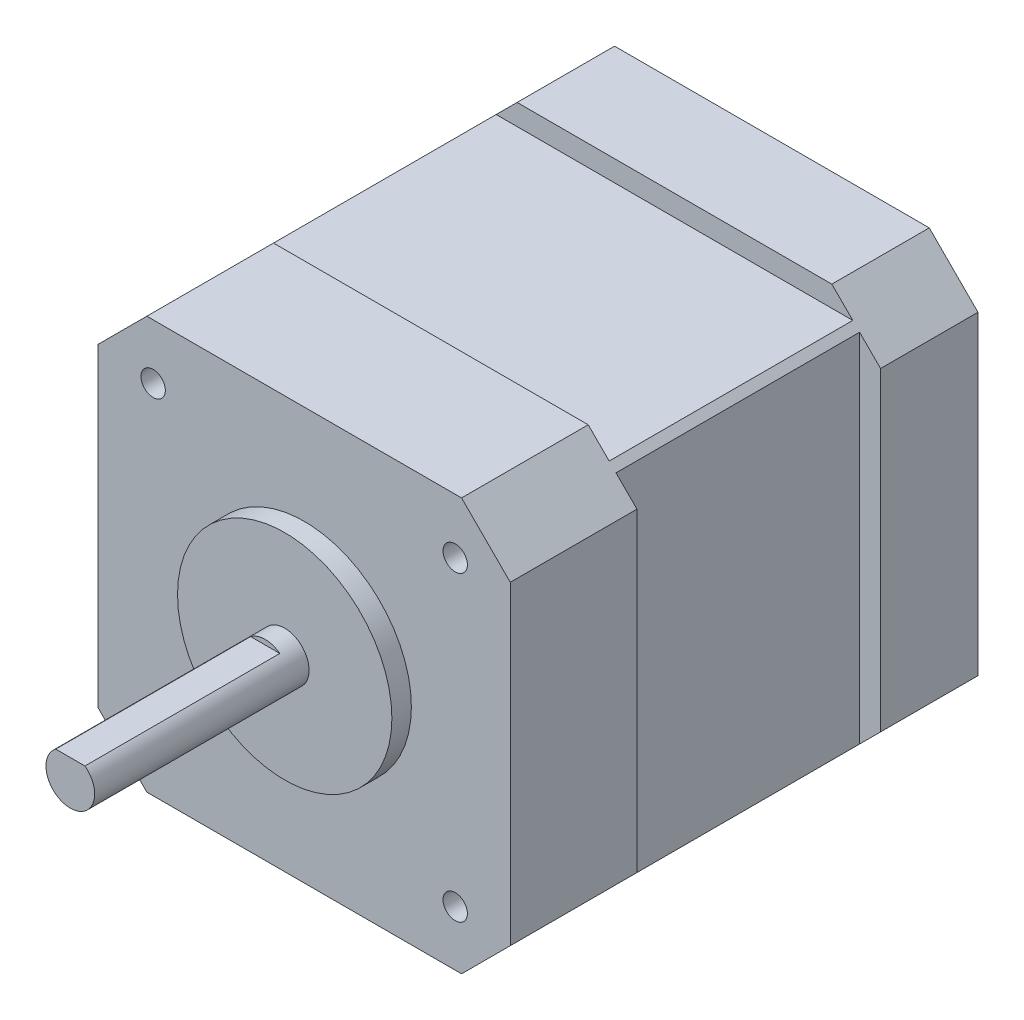
ISO-10303-21;
HEADER;
FILE_DESCRIPTION(('STEP AP214'),'2;1');
FILE_NAME('part.step','',(''),(''),'','','');
FILE_SCHEMA(('AUTOMOTIVE_DESIGN { 1 0 10303 214 1 1 1 1 }'));
ENDSEC;
DATA;
#1=APPLICATION_CONTEXT('core data for automotive mechanical design processes');
#2=APPLICATION_PROTOCOL_DEFINITION('international standard','automotive_design',2000,#1);
#3=PRODUCT_CONTEXT('',#1,'mechanical');
#4=PRODUCT('Part','Part','',(#3));
#5=PRODUCT_RELATED_PRODUCT_CATEGORY('part','',(#4));
#6=PRODUCT_DEFINITION_FORMATION('','',#4);
#7=PRODUCT_DEFINITION_CONTEXT('part definition',#1,'design');
#8=PRODUCT_DEFINITION('design','',#6,#7);
#9=PRODUCT_DEFINITION_SHAPE('','',#8);
#10=(LENGTH_UNIT() NAMED_UNIT(*) SI_UNIT(.MILLI.,.METRE.));
#11=(NAMED_UNIT(*) PLANE_ANGLE_UNIT() SI_UNIT($,.RADIAN.));
#12=(NAMED_UNIT(*) SI_UNIT($,.STERADIAN.) SOLID_ANGLE_UNIT());
#13=UNCERTAINTY_MEASURE_WITH_UNIT(LENGTH_MEASURE(1.E-05),#10,'distance_accuracy_value','');
#14=(GEOMETRIC_REPRESENTATION_CONTEXT(3) GLOBAL_UNCERTAINTY_ASSIGNED_CONTEXT((#13)) GLOBAL_UNIT_ASSIGNED_CONTEXT((#10,
#11,#12)) REPRESENTATION_CONTEXT('',''));
#15=CARTESIAN_POINT('',(0.,0.,0.));
#16=DIRECTION('',(0.,0.,1.));
#17=DIRECTION('',(1.,0.,0.));
#18=AXIS2_PLACEMENT_3D('',#15,#16,#17);
#19=CARTESIAN_POINT('',(0.,0.,48.));
#20=DIRECTION('',(1.,0.,0.));
#21=DIRECTION('',(0.,1.,0.));
#22=AXIS2_PLACEMENT_3D('',#19,#20,#21);
#23=PLANE('',#22);
#24=DIRECTION('',(0.,1.,0.));
#25=VECTOR('',#24,1.);
#26=CARTESIAN_POINT('',(0.,0.,35.));
#27=LINE('',#26,#25);
#28=CARTESIAN_POINT('',(0.,-37.3,35.));
#29=VERTEX_POINT('',#28);
#30=CARTESIAN_POINT('',(0.,-5.,35.));
#31=VERTEX_POINT('',#30);
#32=EDGE_CURVE('E407',#29,#31,#27,.T.);
#33=ORIENTED_EDGE('',*,*,#32,.F.);
#34=DIRECTION('',(0.,0.,1.));
#35=VECTOR('',#34,1.);
#36=CARTESIAN_POINT('',(0.,-37.3,48.));
#37=LINE('',#36,#35);
#38=CARTESIAN_POINT('',(0.,-37.3,48.));
#39=VERTEX_POINT('',#38);
#40=EDGE_CURVE('E309',#29,#39,#37,.T.);
#41=ORIENTED_EDGE('',*,*,#40,.T.);
#42=DIRECTION('',(0.,-1.,0.));
#43=VECTOR('',#42,1.);
#44=CARTESIAN_POINT('',(0.,0.,48.));
#45=LINE('',#44,#43);
#46=CARTESIAN_POINT('',(0.,-4.99999999999999,48.));
#47=VERTEX_POINT('',#46);
#48=EDGE_CURVE('E250',#47,#39,#45,.T.);
#49=ORIENTED_EDGE('',*,*,#48,.F.);
#50=DIRECTION('',(0.,0.,-1.));
#51=VECTOR('',#50,1.);
#52=CARTESIAN_POINT('',(0.,-5.,48.));
#53=LINE('',#52,#51);
#54=EDGE_CURVE('E306',#47,#31,#53,.T.);
#55=ORIENTED_EDGE('',*,*,#54,.T.);
#56=EDGE_LOOP('',(#33,#41,#49,#55));
#57=FACE_BOUND('',#56,.T.);
#58=ADVANCED_FACE('F37',(#57),#23,.F.);
#59=CARTESIAN_POINT('',(0.,-42.3,48.));
#60=DIRECTION('',(0.,1.,0.));
#61=DIRECTION('',(0.,0.,1.));
#62=AXIS2_PLACEMENT_3D('',#59,#60,#61);
#63=PLANE('',#62);
#64=DIRECTION('',(-1.,0.,0.));
#65=VECTOR('',#64,1.);
#66=CARTESIAN_POINT('',(0.,-42.3,35.));
#67=LINE('',#66,#65);
#68=CARTESIAN_POINT('',(37.3,-42.3,35.));
#69=VERTEX_POINT('',#68);
#70=CARTESIAN_POINT('',(4.99999999999998,-42.3,35.));
#71=VERTEX_POINT('',#70);
#72=EDGE_CURVE('E412',#69,#71,#67,.T.);
#73=ORIENTED_EDGE('',*,*,#72,.F.);
#74=DIRECTION('',(0.,0.,1.));
#75=VECTOR('',#74,1.);
#76=CARTESIAN_POINT('',(37.3,-42.3,48.));
#77=LINE('',#76,#75);
#78=CARTESIAN_POINT('',(37.3,-42.3,48.));
#79=VERTEX_POINT('',#78);
#80=EDGE_CURVE('E293',#69,#79,#77,.T.);
#81=ORIENTED_EDGE('',*,*,#80,.T.);
#82=DIRECTION('',(1.,0.,0.));
#83=VECTOR('',#82,1.);
#84=CARTESIAN_POINT('',(0.,-42.3,48.));
#85=LINE('',#84,#83);
#86=CARTESIAN_POINT('',(4.99999999999998,-42.3,48.));
#87=VERTEX_POINT('',#86);
#88=EDGE_CURVE('E253',#87,#79,#85,.T.);
#89=ORIENTED_EDGE('',*,*,#88,.F.);
#90=DIRECTION('',(0.,0.,-1.));
#91=VECTOR('',#90,1.);
#92=CARTESIAN_POINT('',(4.99999999999998,-42.3,48.));
#93=LINE('',#92,#91);
#94=EDGE_CURVE('E290',#87,#71,#93,.T.);
#95=ORIENTED_EDGE('',*,*,#94,.T.);
#96=EDGE_LOOP('',(#73,#81,#89,#95));
#97=FACE_BOUND('',#96,.T.);
#98=ADVANCED_FACE('F459',(#97),#63,.F.);
#99=CARTESIAN_POINT('',(42.3,0.,48.));
#100=DIRECTION('',(-1.,0.,0.));
#101=DIRECTION('',(0.,-1.,0.));
#102=AXIS2_PLACEMENT_3D('',#99,#100,#101);
#103=PLANE('',#102);
#104=DIRECTION('',(0.,-1.,0.));
#105=VECTOR('',#104,1.);
#106=CARTESIAN_POINT('',(42.3,0.,35.));
#107=LINE('',#106,#105);
#108=CARTESIAN_POINT('',(42.3,-5.00000000000002,35.));
#109=VERTEX_POINT('',#108);
#110=CARTESIAN_POINT('',(42.3,-37.3,35.));
#111=VERTEX_POINT('',#110);
#112=EDGE_CURVE('E400',#109,#111,#107,.T.);
#113=ORIENTED_EDGE('',*,*,#112,.F.);
#114=DIRECTION('',(0.,0.,1.));
#115=VECTOR('',#114,1.);
#116=CARTESIAN_POINT('',(42.3,-5.00000000000002,48.));
#117=LINE('',#116,#115);
#118=CARTESIAN_POINT('',(42.3,-5.,48.));
#119=VERTEX_POINT('',#118);
#120=EDGE_CURVE('E263',#109,#119,#117,.T.);
#121=ORIENTED_EDGE('',*,*,#120,.T.);
#122=DIRECTION('',(0.,1.,0.));
#123=VECTOR('',#122,1.);
#124=CARTESIAN_POINT('',(42.3,0.,48.));
#125=LINE('',#124,#123);
#126=CARTESIAN_POINT('',(42.3,-37.3,48.));
#127=VERTEX_POINT('',#126);
#128=EDGE_CURVE('E257',#127,#119,#125,.T.);
#129=ORIENTED_EDGE('',*,*,#128,.F.);
#130=DIRECTION('',(0.,0.,-1.));
#131=VECTOR('',#130,1.);
#132=CARTESIAN_POINT('',(42.3,-37.3,48.));
#133=LINE('',#132,#131);
#134=EDGE_CURVE('E278',#127,#111,#133,.T.);
#135=ORIENTED_EDGE('',*,*,#134,.T.);
#136=EDGE_LOOP('',(#113,#121,#129,#135));
#137=FACE_BOUND('',#136,.T.);
#138=ADVANCED_FACE('F466',(#137),#103,.F.);
#139=CARTESIAN_POINT('',(0.,0.,48.));
#140=DIRECTION('',(0.,-1.,0.));
#141=DIRECTION('',(0.,0.,-1.));
#142=AXIS2_PLACEMENT_3D('',#139,#140,#141);
#143=PLANE('',#142);
#144=DIRECTION('',(1.,0.,0.));
#145=VECTOR('',#144,1.);
#146=CARTESIAN_POINT('',(0.,0.,35.));
#147=LINE('',#146,#145);
#148=CARTESIAN_POINT('',(5.00000000000002,0.,35.));
#149=VERTEX_POINT('',#148);
#150=CARTESIAN_POINT('',(37.3,0.,35.));
#151=VERTEX_POINT('',#150);
#152=EDGE_CURVE('E395',#149,#151,#147,.T.);
#153=ORIENTED_EDGE('',*,*,#152,.F.);
#154=DIRECTION('',(0.,0.,1.));
#155=VECTOR('',#154,1.);
#156=CARTESIAN_POINT('',(5.00000000000002,0.,48.));
#157=LINE('',#156,#155);
#158=CARTESIAN_POINT('',(5.00000000000002,0.,48.));
#159=VERTEX_POINT('',#158);
#160=EDGE_CURVE('E317',#149,#159,#157,.T.);
#161=ORIENTED_EDGE('',*,*,#160,.T.);
#162=DIRECTION('',(-1.,0.,0.));
#163=VECTOR('',#162,1.);
#164=CARTESIAN_POINT('',(0.,0.,48.));
#165=LINE('',#164,#163);
#166=CARTESIAN_POINT('',(37.3,0.,48.));
#167=VERTEX_POINT('',#166);
#168=EDGE_CURVE('E260',#167,#159,#165,.T.);
#169=ORIENTED_EDGE('',*,*,#168,.F.);
#170=DIRECTION('',(0.,0.,-1.));
#171=VECTOR('',#170,1.);
#172=CARTESIAN_POINT('',(37.3,0.,48.));
#173=LINE('',#172,#171);
#174=EDGE_CURVE('E314',#167,#151,#173,.T.);
#175=ORIENTED_EDGE('',*,*,#174,.T.);
#176=EDGE_LOOP('',(#153,#161,#169,#175));
#177=FACE_BOUND('',#176,.T.);
#178=ADVANCED_FACE('F729',(#177),#143,.F.);
#179=CARTESIAN_POINT('',(42.3,-37.3,48.));
#180=DIRECTION('',(-0.707106781186545,0.707106781186549,0.));
#181=DIRECTION('',(-0.707106781186549,-0.707106781186546,0.));
#182=AXIS2_PLACEMENT_3D('',#179,#180,#181);
#183=PLANE('',#182);
#184=DIRECTION('',(0.,0.,-1.));
#185=VECTOR('',#184,1.);
#186=CARTESIAN_POINT('',(40.15,-39.45,48.));
#187=LINE('',#186,#185);
#188=CARTESIAN_POINT('',(40.15,-39.45,10.));
#189=VERTEX_POINT('',#188);
#190=CARTESIAN_POINT('',(40.15,-39.45,35.));
#191=VERTEX_POINT('',#190);
#192=EDGE_CURVE('E373',#189,#191,#187,.F.);
#193=ORIENTED_EDGE('',*,*,#192,.T.);
#194=DIRECTION('',(-0.707106781186549,-0.707106781186546,0.));
#195=VECTOR('',#194,1.);
#196=CARTESIAN_POINT('',(42.3,-37.3,35.));
#197=LINE('',#196,#195);
#198=EDGE_CURVE('E403',#191,#111,#197,.F.);
#199=ORIENTED_EDGE('',*,*,#198,.T.);
#200=ORIENTED_EDGE('',*,*,#134,.F.);
#201=DIRECTION('',(-0.707106781186549,-0.707106781186546,0.));
#202=VECTOR('',#201,1.);
#203=CARTESIAN_POINT('',(18.6499999999999,-60.95,48.));
#204=LINE('',#203,#202);
#205=EDGE_CURVE('E303',#79,#127,#204,.F.);
#206=ORIENTED_EDGE('',*,*,#205,.F.);
#207=ORIENTED_EDGE('',*,*,#80,.F.);
#208=CARTESIAN_POINT('',(39.45,-40.15,35.));
#209=VERTEX_POINT('',#208);
#210=EDGE_CURVE('E406',#69,#209,#197,.F.);
#211=ORIENTED_EDGE('',*,*,#210,.T.);
#212=DIRECTION('',(0.,0.,1.));
#213=VECTOR('',#212,1.);
#214=CARTESIAN_POINT('',(39.45,-40.15,48.));
#215=LINE('',#214,#213);
#216=CARTESIAN_POINT('',(39.45,-40.15,10.));
#217=VERTEX_POINT('',#216);
#218=EDGE_CURVE('E417',#209,#217,#215,.F.);
#219=ORIENTED_EDGE('',*,*,#218,.T.);
#220=DIRECTION('',(-0.707106781186549,-0.707106781186546,0.));
#221=VECTOR('',#220,1.);
#222=CARTESIAN_POINT('',(42.3,-37.3,10.));
#223=LINE('',#222,#221);
#224=CARTESIAN_POINT('',(37.3,-42.3,10.));
#225=VERTEX_POINT('',#224);
#226=EDGE_CURVE('E356',#225,#217,#223,.F.);
#227=ORIENTED_EDGE('',*,*,#226,.F.);
#228=CARTESIAN_POINT('',(37.3,-42.3,0.));
#229=VERTEX_POINT('',#228);
#230=EDGE_CURVE('E294',#229,#225,#77,.T.);
#231=ORIENTED_EDGE('',*,*,#230,.F.);
#232=DIRECTION('',(0.707106781186549,0.707106781186546,0.));
#233=VECTOR('',#232,1.);
#234=CARTESIAN_POINT('',(42.3,-37.3,0.));
#235=LINE('',#234,#233);
#236=CARTESIAN_POINT('',(42.3,-37.3,0.));
#237=VERTEX_POINT('',#236);
#238=EDGE_CURVE('E287',#237,#229,#235,.F.);
#239=ORIENTED_EDGE('',*,*,#238,.F.);
#240=CARTESIAN_POINT('',(42.3,-37.3,10.));
#241=VERTEX_POINT('',#240);
#242=EDGE_CURVE('E277',#241,#237,#133,.T.);
#243=ORIENTED_EDGE('',*,*,#242,.F.);
#244=EDGE_CURVE('E386',#189,#241,#223,.F.);
#245=ORIENTED_EDGE('',*,*,#244,.F.);
#246=EDGE_LOOP('',(#193,#199,#200,#206,#207,#211,#219,#227,#231,#239,#243,#245));
#247=FACE_BOUND('',#246,.T.);
#248=ADVANCED_FACE('F514',(#247),#183,.F.);
#249=CARTESIAN_POINT('',(4.99999999999998,-42.3,48.));
#250=DIRECTION('',(0.707106781186549,0.707106781186546,0.));
#251=DIRECTION('',(-0.707106781186546,0.707106781186549,0.));
#252=AXIS2_PLACEMENT_3D('',#249,#250,#251);
#253=PLANE('',#252);
#254=ORIENTED_EDGE('',*,*,#40,.F.);
#255=DIRECTION('',(-0.707106781186546,0.707106781186549,0.));
#256=VECTOR('',#255,1.);
#257=CARTESIAN_POINT('',(4.99999999999998,-42.3,35.));
#258=LINE('',#257,#256);
#259=CARTESIAN_POINT('',(2.15,-39.45,35.));
#260=VERTEX_POINT('',#259);
#261=EDGE_CURVE('E409',#29,#260,#258,.F.);
#262=ORIENTED_EDGE('',*,*,#261,.T.);
#263=DIRECTION('',(0.,0.,1.));
#264=VECTOR('',#263,1.);
#265=CARTESIAN_POINT('',(2.15,-39.45,48.));
#266=LINE('',#265,#264);
#267=CARTESIAN_POINT('',(2.15,-39.45,10.));
#268=VERTEX_POINT('',#267);
#269=EDGE_CURVE('E414',#260,#268,#266,.F.);
#270=ORIENTED_EDGE('',*,*,#269,.T.);
#271=DIRECTION('',(-0.707106781186546,0.707106781186549,0.));
#272=VECTOR('',#271,1.);
#273=CARTESIAN_POINT('',(4.99999999999998,-42.3,10.));
#274=LINE('',#273,#272);
#275=CARTESIAN_POINT('',(0.,-37.3,10.));
#276=VERTEX_POINT('',#275);
#277=EDGE_CURVE('E391',#276,#268,#274,.F.);
#278=ORIENTED_EDGE('',*,*,#277,.F.);
#279=CARTESIAN_POINT('',(0.,-37.3,0.));
#280=VERTEX_POINT('',#279);
#281=EDGE_CURVE('E310',#280,#276,#37,.T.);
#282=ORIENTED_EDGE('',*,*,#281,.F.);
#283=DIRECTION('',(0.707106781186546,-0.707106781186549,0.));
#284=VECTOR('',#283,1.);
#285=CARTESIAN_POINT('',(4.99999999999998,-42.3,0.));
#286=LINE('',#285,#284);
#287=CARTESIAN_POINT('',(4.99999999999998,-42.3,0.));
#288=VERTEX_POINT('',#287);
#289=EDGE_CURVE('E285',#288,#280,#286,.F.);
#290=ORIENTED_EDGE('',*,*,#289,.F.);
#291=CARTESIAN_POINT('',(4.99999999999998,-42.3,10.));
#292=VERTEX_POINT('',#291);
#293=EDGE_CURVE('E289',#292,#288,#93,.T.);
#294=ORIENTED_EDGE('',*,*,#293,.F.);
#295=CARTESIAN_POINT('',(2.85,-40.15,10.));
#296=VERTEX_POINT('',#295);
#297=EDGE_CURVE('E346',#296,#292,#274,.F.);
#298=ORIENTED_EDGE('',*,*,#297,.F.);
#299=DIRECTION('',(0.,0.,-1.));
#300=VECTOR('',#299,1.);
#301=CARTESIAN_POINT('',(2.85,-40.15,48.));
#302=LINE('',#301,#300);
#303=CARTESIAN_POINT('',(2.85,-40.15,35.));
#304=VERTEX_POINT('',#303);
#305=EDGE_CURVE('E226',#296,#304,#302,.F.);
#306=ORIENTED_EDGE('',*,*,#305,.T.);
#307=EDGE_CURVE('E344',#304,#71,#258,.F.);
#308=ORIENTED_EDGE('',*,*,#307,.T.);
#309=ORIENTED_EDGE('',*,*,#94,.F.);
#310=DIRECTION('',(-0.707106781186546,0.707106781186549,0.));
#311=VECTOR('',#310,1.);
#312=CARTESIAN_POINT('',(2.50000000000001,-39.8,48.));
#313=LINE('',#312,#311);
#314=EDGE_CURVE('E301',#39,#87,#313,.F.);
#315=ORIENTED_EDGE('',*,*,#314,.F.);
#316=EDGE_LOOP('',(#254,#262,#270,#278,#282,#290,#294,#298,#306,#308,#309,#315));
#317=FACE_BOUND('',#316,.T.);
#318=ADVANCED_FACE('F342',(#317),#253,.F.);
#319=CARTESIAN_POINT('',(0.,-5.,48.));
#320=DIRECTION('',(0.707106781186547,-0.707106781186549,0.));
#321=DIRECTION('',(0.707106781186549,0.707106781186547,0.));
#322=AXIS2_PLACEMENT_3D('',#319,#320,#321);
#323=PLANE('',#322);
#324=ORIENTED_EDGE('',*,*,#160,.F.);
#325=DIRECTION('',(0.707106781186549,0.707106781186547,0.));
#326=VECTOR('',#325,1.);
#327=CARTESIAN_POINT('',(0.,-5.,35.));
#328=LINE('',#327,#326);
#329=CARTESIAN_POINT('',(2.85000000000001,-2.15000000000001,35.));
#330=VERTEX_POINT('',#329);
#331=EDGE_CURVE('E397',#149,#330,#328,.F.);
#332=ORIENTED_EDGE('',*,*,#331,.T.);
#333=DIRECTION('',(0.,0.,1.));
#334=VECTOR('',#333,1.);
#335=CARTESIAN_POINT('',(2.85000000000001,-2.15000000000001,48.));
#336=LINE('',#335,#334);
#337=CARTESIAN_POINT('',(2.85000000000001,-2.15000000000001,10.));
#338=VERTEX_POINT('',#337);
#339=EDGE_CURVE('E370',#330,#338,#336,.F.);
#340=ORIENTED_EDGE('',*,*,#339,.T.);
#341=DIRECTION('',(0.707106781186549,0.707106781186547,0.));
#342=VECTOR('',#341,1.);
#343=CARTESIAN_POINT('',(0.,-5.,10.));
#344=LINE('',#343,#342);
#345=CARTESIAN_POINT('',(5.00000000000002,0.,10.));
#346=VERTEX_POINT('',#345);
#347=EDGE_CURVE('E380',#346,#338,#344,.F.);
#348=ORIENTED_EDGE('',*,*,#347,.F.);
#349=CARTESIAN_POINT('',(5.00000000000002,0.,0.));
#350=VERTEX_POINT('',#349);
#351=EDGE_CURVE('E318',#350,#346,#157,.T.);
#352=ORIENTED_EDGE('',*,*,#351,.F.);
#353=DIRECTION('',(-0.707106781186549,-0.707106781186547,0.));
#354=VECTOR('',#353,1.);
#355=CARTESIAN_POINT('',(0.,-5.,0.));
#356=LINE('',#355,#354);
#357=CARTESIAN_POINT('',(0.,-5.,0.));
#358=VERTEX_POINT('',#357);
#359=EDGE_CURVE('E283',#358,#350,#356,.F.);
#360=ORIENTED_EDGE('',*,*,#359,.F.);
#361=CARTESIAN_POINT('',(0.,-5.,10.));
#362=VERTEX_POINT('',#361);
#363=EDGE_CURVE('E305',#362,#358,#53,.T.);
#364=ORIENTED_EDGE('',*,*,#363,.F.);
#365=CARTESIAN_POINT('',(2.15000000000001,-2.85,10.));
#366=VERTEX_POINT('',#365);
#367=EDGE_CURVE('E383',#366,#362,#344,.F.);
#368=ORIENTED_EDGE('',*,*,#367,.F.);
#369=DIRECTION('',(0.,0.,-1.));
#370=VECTOR('',#369,1.);
#371=CARTESIAN_POINT('',(2.15000000000001,-2.85,48.));
#372=LINE('',#371,#370);
#373=CARTESIAN_POINT('',(2.15000000000001,-2.85,35.));
#374=VERTEX_POINT('',#373);
#375=EDGE_CURVE('E334',#366,#374,#372,.F.);
#376=ORIENTED_EDGE('',*,*,#375,.T.);
#377=EDGE_CURVE('E401',#374,#31,#328,.F.);
#378=ORIENTED_EDGE('',*,*,#377,.T.);
#379=ORIENTED_EDGE('',*,*,#54,.F.);
#380=DIRECTION('',(0.707106781186549,0.707106781186547,0.));
#381=VECTOR('',#380,1.);
#382=CARTESIAN_POINT('',(-18.65,-23.6499999999999,48.));
#383=LINE('',#382,#381);
#384=EDGE_CURVE('E299',#159,#47,#383,.F.);
#385=ORIENTED_EDGE('',*,*,#384,.F.);
#386=EDGE_LOOP('',(#324,#332,#340,#348,#352,#360,#364,#368,#376,#378,#379,#385));
#387=FACE_BOUND('',#386,.T.);
#388=ADVANCED_FACE('F502',(#387),#323,.F.);
#389=CARTESIAN_POINT('',(37.3,0.,48.));
#390=DIRECTION('',(-0.707106781186549,-0.707106781186547,0.));
#391=DIRECTION('',(0.707106781186547,-0.707106781186549,0.));
#392=AXIS2_PLACEMENT_3D('',#389,#390,#391);
#393=PLANE('',#392);
#394=ORIENTED_EDGE('',*,*,#120,.F.);
#395=DIRECTION('',(0.707106781186547,-0.707106781186549,0.));
#396=VECTOR('',#395,1.);
#397=CARTESIAN_POINT('',(37.3,0.,35.));
#398=LINE('',#397,#396);
#399=CARTESIAN_POINT('',(40.15,-2.85000000000002,35.));
#400=VERTEX_POINT('',#399);
#401=EDGE_CURVE('E331',#109,#400,#398,.F.);
#402=ORIENTED_EDGE('',*,*,#401,.T.);
#403=DIRECTION('',(0.,0.,1.));
#404=VECTOR('',#403,1.);
#405=CARTESIAN_POINT('',(40.15,-2.85000000000002,48.));
#406=LINE('',#405,#404);
#407=CARTESIAN_POINT('',(40.15,-2.85000000000002,10.));
#408=VERTEX_POINT('',#407);
#409=EDGE_CURVE('E330',#400,#408,#406,.F.);
#410=ORIENTED_EDGE('',*,*,#409,.T.);
#411=DIRECTION('',(0.707106781186547,-0.707106781186549,0.));
#412=VECTOR('',#411,1.);
#413=CARTESIAN_POINT('',(37.3,0.,10.));
#414=LINE('',#413,#412);
#415=CARTESIAN_POINT('',(42.3,-5.00000000000002,10.));
#416=VERTEX_POINT('',#415);
#417=EDGE_CURVE('E327',#416,#408,#414,.F.);
#418=ORIENTED_EDGE('',*,*,#417,.F.);
#419=CARTESIAN_POINT('',(42.3,-5.00000000000002,0.));
#420=VERTEX_POINT('',#419);
#421=EDGE_CURVE('E274',#420,#416,#117,.T.);
#422=ORIENTED_EDGE('',*,*,#421,.F.);
#423=DIRECTION('',(-0.707106781186547,0.707106781186549,0.));
#424=VECTOR('',#423,1.);
#425=CARTESIAN_POINT('',(37.3,0.,0.));
#426=LINE('',#425,#424);
#427=CARTESIAN_POINT('',(37.3,0.,0.));
#428=VERTEX_POINT('',#427);
#429=EDGE_CURVE('E281',#428,#420,#426,.F.);
#430=ORIENTED_EDGE('',*,*,#429,.F.);
#431=CARTESIAN_POINT('',(37.3,0.,10.));
#432=VERTEX_POINT('',#431);
#433=EDGE_CURVE('E313',#432,#428,#173,.T.);
#434=ORIENTED_EDGE('',*,*,#433,.F.);
#435=CARTESIAN_POINT('',(39.45,-2.15000000000001,10.));
#436=VERTEX_POINT('',#435);
#437=EDGE_CURVE('E324',#436,#432,#414,.F.);
#438=ORIENTED_EDGE('',*,*,#437,.F.);
#439=DIRECTION('',(0.,0.,-1.));
#440=VECTOR('',#439,1.);
#441=CARTESIAN_POINT('',(39.45,-2.15000000000001,48.));
#442=LINE('',#441,#440);
#443=CARTESIAN_POINT('',(39.45,-2.15000000000001,35.));
#444=VERTEX_POINT('',#443);
#445=EDGE_CURVE('E321',#436,#444,#442,.F.);
#446=ORIENTED_EDGE('',*,*,#445,.T.);
#447=EDGE_CURVE('E326',#444,#151,#398,.F.);
#448=ORIENTED_EDGE('',*,*,#447,.T.);
#449=ORIENTED_EDGE('',*,*,#174,.F.);
#450=DIRECTION('',(0.707106781186547,-0.707106781186549,0.));
#451=VECTOR('',#450,1.);
#452=CARTESIAN_POINT('',(39.8000000000001,-2.50000000000006,48.));
#453=LINE('',#452,#451);
#454=EDGE_CURVE('E297',#119,#167,#453,.F.);
#455=ORIENTED_EDGE('',*,*,#454,.F.);
#456=EDGE_LOOP('',(#394,#402,#410,#418,#422,#430,#434,#438,#446,#448,#449,#455));
#457=FACE_BOUND('',#456,.T.);
#458=ADVANCED_FACE('F39',(#457),#393,.F.);
#459=CARTESIAN_POINT('',(21.15,-21.15,50.));
#460=DIRECTION('',(0.,0.,1.));
#461=DIRECTION('',(1.,0.,0.));
#462=AXIS2_PLACEMENT_3D('',#459,#460,#461);
#463=PLANE('',#462);
#464=CARTESIAN_POINT('',(21.15,-21.15,50.));
#465=DIRECTION('',(0.,0.,1.));
#466=DIRECTION('',(1.,0.,0.));
#467=AXIS2_PLACEMENT_3D('',#464,#465,#466);
#468=CIRCLE('',#467,11.);
#469=CARTESIAN_POINT('',(32.15,-21.15,50.));
#470=VERTEX_POINT('',#469);
#471=EDGE_CURVE('E239',#470,#470,#468,.T.);
#472=ORIENTED_EDGE('',*,*,#471,.T.);
#473=EDGE_LOOP('',(#472));
#474=FACE_BOUND('',#473,.T.);
#475=CARTESIAN_POINT('',(21.15,-21.15,50.));
#476=DIRECTION('',(0.,0.,1.));
#477=DIRECTION('',(1.,0.,0.));
#478=AXIS2_PLACEMENT_3D('',#475,#476,#477);
#479=CIRCLE('',#478,2.5);
#480=CARTESIAN_POINT('',(23.65,-21.15,50.));
#481=VERTEX_POINT('',#480);
#482=EDGE_CURVE('E236',#481,#481,#479,.T.);
#483=ORIENTED_EDGE('',*,*,#482,.F.);
#484=EDGE_LOOP('',(#483));
#485=FACE_BOUND('',#484,.T.);
#486=ADVANCED_FACE('F481',(#474,#485),#463,.T.);
#487=CARTESIAN_POINT('',(0.,-42.3,48.));
#488=DIRECTION('',(0.,0.,1.));
#489=DIRECTION('',(1.,0.,0.));
#490=AXIS2_PLACEMENT_3D('',#487,#488,#489);
#491=PLANE('',#490);
#492=CARTESIAN_POINT('',(5.65000000000001,-5.65,48.));
#493=DIRECTION('',(0.,0.,1.));
#494=DIRECTION('',(1.,0.,0.));
#495=AXIS2_PLACEMENT_3D('',#492,#493,#494);
#496=CIRCLE('',#495,1.24999999999999);
#497=CARTESIAN_POINT('',(6.9,-5.65,48.));
#498=VERTEX_POINT('',#497);
#499=EDGE_CURVE('E419',#498,#498,#496,.T.);
#500=ORIENTED_EDGE('',*,*,#499,.F.);
#501=EDGE_LOOP('',(#500));
#502=FACE_BOUND('',#501,.T.);
#503=CARTESIAN_POINT('',(5.65000000000001,-36.65,48.));
#504=DIRECTION('',(0.,0.,1.));
#505=DIRECTION('',(1.,0.,0.));
#506=AXIS2_PLACEMENT_3D('',#503,#504,#505);
#507=CIRCLE('',#506,1.24999999999999);
#508=CARTESIAN_POINT('',(6.9,-36.65,48.));
#509=VERTEX_POINT('',#508);
#510=EDGE_CURVE('E425',#509,#509,#507,.T.);
#511=ORIENTED_EDGE('',*,*,#510,.F.);
#512=EDGE_LOOP('',(#511));
#513=FACE_BOUND('',#512,.T.);
#514=CARTESIAN_POINT('',(36.65,-36.65,48.));
#515=DIRECTION('',(0.,0.,1.));
#516=DIRECTION('',(1.,0.,0.));
#517=AXIS2_PLACEMENT_3D('',#514,#515,#516);
#518=CIRCLE('',#517,1.24999999999999);
#519=CARTESIAN_POINT('',(37.9,-36.65,48.));
#520=VERTEX_POINT('',#519);
#521=EDGE_CURVE('E431',#520,#520,#518,.T.);
#522=ORIENTED_EDGE('',*,*,#521,.F.);
#523=EDGE_LOOP('',(#522));
#524=FACE_BOUND('',#523,.T.);
#525=CARTESIAN_POINT('',(36.65,-5.65,48.));
#526=DIRECTION('',(0.,0.,1.));
#527=DIRECTION('',(1.,0.,0.));
#528=AXIS2_PLACEMENT_3D('',#525,#526,#527);
#529=CIRCLE('',#528,1.24999999999999);
#530=CARTESIAN_POINT('',(37.9,-5.65,48.));
#531=VERTEX_POINT('',#530);
#532=EDGE_CURVE('E436',#531,#531,#529,.T.);
#533=ORIENTED_EDGE('',*,*,#532,.F.);
#534=EDGE_LOOP('',(#533));
#535=FACE_BOUND('',#534,.T.);
#536=ORIENTED_EDGE('',*,*,#88,.T.);
#537=ORIENTED_EDGE('',*,*,#205,.T.);
#538=ORIENTED_EDGE('',*,*,#128,.T.);
#539=ORIENTED_EDGE('',*,*,#454,.T.);
#540=ORIENTED_EDGE('',*,*,#168,.T.);
#541=ORIENTED_EDGE('',*,*,#384,.T.);
#542=ORIENTED_EDGE('',*,*,#48,.T.);
#543=ORIENTED_EDGE('',*,*,#314,.T.);
#544=EDGE_LOOP('',(#536,#537,#538,#539,#540,#541,#542,#543));
#545=FACE_BOUND('',#544,.T.);
#546=CARTESIAN_POINT('',(21.15,-21.15,48.));
#547=DIRECTION('',(0.,0.,1.));
#548=DIRECTION('',(1.,0.,0.));
#549=AXIS2_PLACEMENT_3D('',#546,#547,#548);
#550=CIRCLE('',#549,11.);
#551=CARTESIAN_POINT('',(32.15,-21.15,48.));
#552=VERTEX_POINT('',#551);
#553=EDGE_CURVE('E235',#552,#552,#550,.T.);
#554=ORIENTED_EDGE('',*,*,#553,.F.);
#555=EDGE_LOOP('',(#554));
#556=FACE_BOUND('',#555,.T.);
#557=ADVANCED_FACE('F473',(#502,#513,#524,#535,#545,#556),#491,.T.);
#558=ORIENTED_EDGE('',*,*,#281,.T.);
#559=DIRECTION('',(0.,1.,0.));
#560=VECTOR('',#559,1.);
#561=CARTESIAN_POINT('',(0.,0.,10.));
#562=LINE('',#561,#560);
#563=EDGE_CURVE('E388',#276,#362,#562,.T.);
#564=ORIENTED_EDGE('',*,*,#563,.T.);
#565=ORIENTED_EDGE('',*,*,#363,.T.);
#566=DIRECTION('',(0.,-1.,0.));
#567=VECTOR('',#566,1.);
#568=CARTESIAN_POINT('',(0.,0.,0.));
#569=LINE('',#568,#567);
#570=EDGE_CURVE('E248',#358,#280,#569,.T.);
#571=ORIENTED_EDGE('',*,*,#570,.T.);
#572=EDGE_LOOP('',(#558,#564,#565,#571));
#573=FACE_BOUND('',#572,.T.);
#574=ADVANCED_FACE('F462',(#573),#23,.F.);
#575=ORIENTED_EDGE('',*,*,#230,.T.);
#576=DIRECTION('',(-1.,0.,0.));
#577=VECTOR('',#576,1.);
#578=CARTESIAN_POINT('',(0.,-42.3,10.));
#579=LINE('',#578,#577);
#580=EDGE_CURVE('E393',#225,#292,#579,.T.);
#581=ORIENTED_EDGE('',*,*,#580,.T.);
#582=ORIENTED_EDGE('',*,*,#293,.T.);
#583=DIRECTION('',(1.,0.,0.));
#584=VECTOR('',#583,1.);
#585=CARTESIAN_POINT('',(0.,-42.3,0.));
#586=LINE('',#585,#584);
#587=EDGE_CURVE('E266',#288,#229,#586,.T.);
#588=ORIENTED_EDGE('',*,*,#587,.T.);
#589=EDGE_LOOP('',(#575,#581,#582,#588));
#590=FACE_BOUND('',#589,.T.);
#591=ADVANCED_FACE('F469',(#590),#63,.F.);
#592=ORIENTED_EDGE('',*,*,#421,.T.);
#593=DIRECTION('',(0.,-1.,0.));
#594=VECTOR('',#593,1.);
#595=CARTESIAN_POINT('',(42.3,0.,10.));
#596=LINE('',#595,#594);
#597=EDGE_CURVE('E382',#416,#241,#596,.T.);
#598=ORIENTED_EDGE('',*,*,#597,.T.);
#599=ORIENTED_EDGE('',*,*,#242,.T.);
#600=DIRECTION('',(0.,1.,0.));
#601=VECTOR('',#600,1.);
#602=CARTESIAN_POINT('',(42.3,0.,0.));
#603=LINE('',#602,#601);
#604=EDGE_CURVE('E269',#237,#420,#603,.T.);
#605=ORIENTED_EDGE('',*,*,#604,.T.);
#606=EDGE_LOOP('',(#592,#598,#599,#605));
#607=FACE_BOUND('',#606,.T.);
#608=ADVANCED_FACE('F479',(#607),#103,.F.);
#609=ORIENTED_EDGE('',*,*,#351,.T.);
#610=DIRECTION('',(1.,0.,0.));
#611=VECTOR('',#610,1.);
#612=CARTESIAN_POINT('',(0.,0.,10.));
#613=LINE('',#612,#611);
#614=EDGE_CURVE('E377',#346,#432,#613,.T.);
#615=ORIENTED_EDGE('',*,*,#614,.T.);
#616=ORIENTED_EDGE('',*,*,#433,.T.);
#617=DIRECTION('',(-1.,0.,0.));
#618=VECTOR('',#617,1.);
#619=CARTESIAN_POINT('',(0.,0.,0.));
#620=LINE('',#619,#618);
#621=EDGE_CURVE('E254',#428,#350,#620,.T.);
#622=ORIENTED_EDGE('',*,*,#621,.T.);
#623=EDGE_LOOP('',(#609,#615,#616,#622));
#624=FACE_BOUND('',#623,.T.);
#625=ADVANCED_FACE('F543',(#624),#143,.F.);
#626=CARTESIAN_POINT('',(0.,-42.3,0.));
#627=DIRECTION('',(0.,0.,1.));
#628=DIRECTION('',(1.,0.,0.));
#629=AXIS2_PLACEMENT_3D('',#626,#627,#628);
#630=PLANE('',#629);
#631=ORIENTED_EDGE('',*,*,#604,.F.);
#632=ORIENTED_EDGE('',*,*,#238,.T.);
#633=ORIENTED_EDGE('',*,*,#587,.F.);
#634=ORIENTED_EDGE('',*,*,#289,.T.);
#635=ORIENTED_EDGE('',*,*,#570,.F.);
#636=ORIENTED_EDGE('',*,*,#359,.T.);
#637=ORIENTED_EDGE('',*,*,#621,.F.);
#638=ORIENTED_EDGE('',*,*,#429,.T.);
#639=EDGE_LOOP('',(#631,#632,#633,#634,#635,#636,#637,#638));
#640=FACE_BOUND('',#639,.T.);
#641=ADVANCED_FACE('F510',(#640),#630,.F.);
#642=CARTESIAN_POINT('',(21.15,-21.15,50.));
#643=DIRECTION('',(0.,0.,-1.));
#644=DIRECTION('',(-1.,0.,0.));
#645=AXIS2_PLACEMENT_3D('',#642,#643,#644);
#646=CYLINDRICAL_SURFACE('',#645,11.);
#647=ORIENTED_EDGE('',*,*,#471,.F.);
#648=EDGE_LOOP('',(#647));
#649=FACE_BOUND('',#648,.T.);
#650=ORIENTED_EDGE('',*,*,#553,.T.);
#651=EDGE_LOOP('',(#650));
#652=FACE_BOUND('',#651,.T.);
#653=ADVANCED_FACE('F651',(#649,#652),#646,.T.);
#654=CARTESIAN_POINT('',(21.15,-21.15,72.));
#655=DIRECTION('',(0.,0.,-1.));
#656=DIRECTION('',(-1.,0.,0.));
#657=AXIS2_PLACEMENT_3D('',#654,#655,#656);
#658=CYLINDRICAL_SURFACE('',#657,2.5);
#659=CARTESIAN_POINT('',(21.15,-21.15,72.));
#660=DIRECTION('',(0.,0.,1.));
#661=DIRECTION('',(1.,0.,0.));
#662=AXIS2_PLACEMENT_3D('',#659,#660,#661);
#663=CIRCLE('',#662,2.5);
#664=CARTESIAN_POINT('',(19.65,-19.15,72.));
#665=VERTEX_POINT('',#664);
#666=CARTESIAN_POINT('',(22.65,-19.15,72.));
#667=VERTEX_POINT('',#666);
#668=EDGE_CURVE('E231',#665,#667,#663,.T.);
#669=ORIENTED_EDGE('',*,*,#668,.F.);
#670=DIRECTION('',(0.,0.,-1.));
#671=VECTOR('',#670,1.);
#672=CARTESIAN_POINT('',(19.65,-19.15,72.));
#673=LINE('',#672,#671);
#674=CARTESIAN_POINT('',(19.65,-19.15,52.));
#675=VERTEX_POINT('',#674);
#676=EDGE_CURVE('E52',#665,#675,#673,.T.);
#677=ORIENTED_EDGE('',*,*,#676,.T.);
#678=CARTESIAN_POINT('',(21.15,-21.15,52.));
#679=DIRECTION('',(0.,0.,1.));
#680=DIRECTION('',(1.,0.,0.));
#681=AXIS2_PLACEMENT_3D('',#678,#679,#680);
#682=CIRCLE('',#681,2.5);
#683=CARTESIAN_POINT('',(22.65,-19.15,52.));
#684=VERTEX_POINT('',#683);
#685=EDGE_CURVE('E12',#684,#675,#682,.T.);
#686=ORIENTED_EDGE('',*,*,#685,.F.);
#687=DIRECTION('',(0.,0.,-1.));
#688=VECTOR('',#687,1.);
#689=CARTESIAN_POINT('',(22.65,-19.15,72.));
#690=LINE('',#689,#688);
#691=EDGE_CURVE('E221',#684,#667,#690,.F.);
#692=ORIENTED_EDGE('',*,*,#691,.T.);
#693=EDGE_LOOP('',(#669,#677,#686,#692));
#694=FACE_BOUND('',#693,.T.);
#695=ORIENTED_EDGE('',*,*,#482,.T.);
#696=EDGE_LOOP('',(#695));
#697=FACE_BOUND('',#696,.T.);
#698=ADVANCED_FACE('F229',(#694,#697),#658,.T.);
#699=CARTESIAN_POINT('',(21.15,-21.15,72.));
#700=DIRECTION('',(0.,0.,1.));
#701=DIRECTION('',(1.,0.,0.));
#702=AXIS2_PLACEMENT_3D('',#699,#700,#701);
#703=PLANE('',#702);
#704=DIRECTION('',(1.,0.,0.));
#705=VECTOR('',#704,1.);
#706=CARTESIAN_POINT('',(21.15,-19.15,72.));
#707=LINE('',#706,#705);
#708=EDGE_CURVE('E45',#665,#667,#707,.T.);
#709=ORIENTED_EDGE('',*,*,#708,.F.);
#710=ORIENTED_EDGE('',*,*,#668,.T.);
#711=EDGE_LOOP('',(#709,#710));
#712=FACE_BOUND('',#711,.T.);
#713=ADVANCED_FACE('F234',(#712),#703,.T.);
#714=CARTESIAN_POINT('',(36.65,-5.65,42.));
#715=DIRECTION('',(0.,0.,1.));
#716=DIRECTION('',(1.,0.,0.));
#717=AXIS2_PLACEMENT_3D('',#714,#715,#716);
#718=CONICAL_SURFACE('',#717,1.24999999999999,1.02974425867665);
#719=CARTESIAN_POINT('',(36.65,-5.65,41.2489242262155));
#720=VERTEX_POINT('',#719);
#721=VERTEX_LOOP('',#720);
#722=FACE_BOUND('',#721,.T.);
#723=CARTESIAN_POINT('',(36.65,-5.65,42.));
#724=DIRECTION('',(0.,0.,1.));
#725=DIRECTION('',(1.,0.,0.));
#726=AXIS2_PLACEMENT_3D('',#723,#724,#725);
#727=CIRCLE('',#726,1.24999999999999);
#728=CARTESIAN_POINT('',(37.9,-5.65,42.));
#729=VERTEX_POINT('',#728);
#730=EDGE_CURVE('E242',#729,#729,#727,.T.);
#731=ORIENTED_EDGE('',*,*,#730,.T.);
#732=EDGE_LOOP('',(#731));
#733=FACE_BOUND('',#732,.T.);
#734=ADVANCED_FACE('F443',(#722,#733),#718,.F.);
#735=CARTESIAN_POINT('',(36.65,-5.65,48.));
#736=DIRECTION('',(0.,0.,1.));
#737=DIRECTION('',(1.,0.,0.));
#738=AXIS2_PLACEMENT_3D('',#735,#736,#737);
#739=CYLINDRICAL_SURFACE('',#738,1.24999999999999);
#740=ORIENTED_EDGE('',*,*,#730,.F.);
#741=EDGE_LOOP('',(#740));
#742=FACE_BOUND('',#741,.T.);
#743=ORIENTED_EDGE('',*,*,#532,.T.);
#744=EDGE_LOOP('',(#743));
#745=FACE_BOUND('',#744,.T.);
#746=ADVANCED_FACE('F445',(#742,#745),#739,.F.);
#747=CARTESIAN_POINT('',(36.65,-36.65,42.));
#748=DIRECTION('',(0.,0.,1.));
#749=DIRECTION('',(1.,0.,0.));
#750=AXIS2_PLACEMENT_3D('',#747,#748,#749);
#751=CONICAL_SURFACE('',#750,1.24999999999999,1.02974425867665);
#752=CARTESIAN_POINT('',(36.65,-36.65,41.2489242262155));
#753=VERTEX_POINT('',#752);
#754=VERTEX_LOOP('',#753);
#755=FACE_BOUND('',#754,.T.);
#756=CARTESIAN_POINT('',(36.65,-36.65,42.));
#757=DIRECTION('',(0.,0.,1.));
#758=DIRECTION('',(1.,0.,0.));
#759=AXIS2_PLACEMENT_3D('',#756,#757,#758);
#760=CIRCLE('',#759,1.24999999999999);
#761=CARTESIAN_POINT('',(37.9,-36.65,42.));
#762=VERTEX_POINT('',#761);
#763=EDGE_CURVE('E434',#762,#762,#760,.T.);
#764=ORIENTED_EDGE('',*,*,#763,.T.);
#765=EDGE_LOOP('',(#764));
#766=FACE_BOUND('',#765,.T.);
#767=ADVANCED_FACE('F447',(#755,#766),#751,.F.);
#768=CARTESIAN_POINT('',(36.65,-36.65,48.));
#769=DIRECTION('',(0.,0.,1.));
#770=DIRECTION('',(1.,0.,0.));
#771=AXIS2_PLACEMENT_3D('',#768,#769,#770);
#772=CYLINDRICAL_SURFACE('',#771,1.24999999999999);
#773=ORIENTED_EDGE('',*,*,#763,.F.);
#774=EDGE_LOOP('',(#773));
#775=FACE_BOUND('',#774,.T.);
#776=ORIENTED_EDGE('',*,*,#521,.T.);
#777=EDGE_LOOP('',(#776));
#778=FACE_BOUND('',#777,.T.);
#779=ADVANCED_FACE('F453',(#775,#778),#772,.F.);
#780=CARTESIAN_POINT('',(5.65000000000001,-36.65,42.));
#781=DIRECTION('',(0.,0.,1.));
#782=DIRECTION('',(1.,0.,0.));
#783=AXIS2_PLACEMENT_3D('',#780,#781,#782);
#784=CONICAL_SURFACE('',#783,1.24999999999999,1.02974425867665);
#785=CARTESIAN_POINT('',(5.65000000000001,-36.65,41.2489242262155));
#786=VERTEX_POINT('',#785);
#787=VERTEX_LOOP('',#786);
#788=FACE_BOUND('',#787,.T.);
#789=CARTESIAN_POINT('',(5.65000000000001,-36.65,42.));
#790=DIRECTION('',(0.,0.,1.));
#791=DIRECTION('',(1.,0.,0.));
#792=AXIS2_PLACEMENT_3D('',#789,#790,#791);
#793=CIRCLE('',#792,1.24999999999999);
#794=CARTESIAN_POINT('',(6.9,-36.65,42.));
#795=VERTEX_POINT('',#794);
#796=EDGE_CURVE('E428',#795,#795,#793,.T.);
#797=ORIENTED_EDGE('',*,*,#796,.T.);
#798=EDGE_LOOP('',(#797));
#799=FACE_BOUND('',#798,.T.);
#800=ADVANCED_FACE('F699',(#788,#799),#784,.F.);
#801=CARTESIAN_POINT('',(5.65000000000001,-36.65,48.));
#802=DIRECTION('',(0.,0.,1.));
#803=DIRECTION('',(1.,0.,0.));
#804=AXIS2_PLACEMENT_3D('',#801,#802,#803);
#805=CYLINDRICAL_SURFACE('',#804,1.24999999999999);
#806=ORIENTED_EDGE('',*,*,#796,.F.);
#807=EDGE_LOOP('',(#806));
#808=FACE_BOUND('',#807,.T.);
#809=ORIENTED_EDGE('',*,*,#510,.T.);
#810=EDGE_LOOP('',(#809));
#811=FACE_BOUND('',#810,.T.);
#812=ADVANCED_FACE('F691',(#808,#811),#805,.F.);
#813=CARTESIAN_POINT('',(5.65000000000001,-5.65,42.));
#814=DIRECTION('',(0.,0.,1.));
#815=DIRECTION('',(1.,0.,0.));
#816=AXIS2_PLACEMENT_3D('',#813,#814,#815);
#817=CONICAL_SURFACE('',#816,1.24999999999999,1.02974425867665);
#818=CARTESIAN_POINT('',(5.65000000000001,-5.65,41.2489242262155));
#819=VERTEX_POINT('',#818);
#820=VERTEX_LOOP('',#819);
#821=FACE_BOUND('',#820,.T.);
#822=CARTESIAN_POINT('',(5.65000000000001,-5.65,42.));
#823=DIRECTION('',(0.,0.,1.));
#824=DIRECTION('',(1.,0.,0.));
#825=AXIS2_PLACEMENT_3D('',#822,#823,#824);
#826=CIRCLE('',#825,1.24999999999999);
#827=CARTESIAN_POINT('',(6.9,-5.65,42.));
#828=VERTEX_POINT('',#827);
#829=EDGE_CURVE('E422',#828,#828,#826,.T.);
#830=ORIENTED_EDGE('',*,*,#829,.T.);
#831=EDGE_LOOP('',(#830));
#832=FACE_BOUND('',#831,.T.);
#833=ADVANCED_FACE('F686',(#821,#832),#817,.F.);
#834=CARTESIAN_POINT('',(5.65000000000001,-5.65,48.));
#835=DIRECTION('',(0.,0.,1.));
#836=DIRECTION('',(1.,0.,0.));
#837=AXIS2_PLACEMENT_3D('',#834,#835,#836);
#838=CYLINDRICAL_SURFACE('',#837,1.24999999999999);
#839=ORIENTED_EDGE('',*,*,#829,.F.);
#840=EDGE_LOOP('',(#839));
#841=FACE_BOUND('',#840,.T.);
#842=ORIENTED_EDGE('',*,*,#499,.T.);
#843=EDGE_LOOP('',(#842));
#844=FACE_BOUND('',#843,.T.);
#845=ADVANCED_FACE('F682',(#841,#844),#838,.F.);
#846=CARTESIAN_POINT('',(40.15,-2.15000000000001,35.));
#847=DIRECTION('',(0.,1.,0.));
#848=DIRECTION('',(-1.,0.,0.));
#849=AXIS2_PLACEMENT_3D('',#846,#847,#848);
#850=PLANE('',#849);
#851=DIRECTION('',(1.,0.,0.));
#852=VECTOR('',#851,1.);
#853=CARTESIAN_POINT('',(40.15,-2.15000000000001,35.));
#854=LINE('',#853,#852);
#855=EDGE_CURVE('E374',#330,#444,#854,.T.);
#856=ORIENTED_EDGE('',*,*,#855,.T.);
#857=ORIENTED_EDGE('',*,*,#445,.F.);
#858=DIRECTION('',(1.,0.,0.));
#859=VECTOR('',#858,1.);
#860=CARTESIAN_POINT('',(40.15,-2.15000000000001,10.));
#861=LINE('',#860,#859);
#862=EDGE_CURVE('E361',#338,#436,#861,.T.);
#863=ORIENTED_EDGE('',*,*,#862,.F.);
#864=ORIENTED_EDGE('',*,*,#339,.F.);
#865=EDGE_LOOP('',(#856,#857,#863,#864));
#866=FACE_BOUND('',#865,.T.);
#867=ADVANCED_FACE('F529',(#866),#850,.T.);
#868=CARTESIAN_POINT('',(21.15,-21.15,10.));
#869=DIRECTION('',(0.,0.,-1.));
#870=DIRECTION('',(-1.,0.,0.));
#871=AXIS2_PLACEMENT_3D('',#868,#869,#870);
#872=PLANE('',#871);
#873=ORIENTED_EDGE('',*,*,#347,.T.);
#874=ORIENTED_EDGE('',*,*,#862,.T.);
#875=ORIENTED_EDGE('',*,*,#437,.T.);
#876=ORIENTED_EDGE('',*,*,#614,.F.);
#877=EDGE_LOOP('',(#873,#874,#875,#876));
#878=FACE_BOUND('',#877,.T.);
#879=ADVANCED_FACE('F541',(#878),#872,.F.);
#880=CARTESIAN_POINT('',(21.15,-21.15,35.));
#881=DIRECTION('',(0.,0.,-1.));
#882=DIRECTION('',(-1.,0.,0.));
#883=AXIS2_PLACEMENT_3D('',#880,#881,#882);
#884=PLANE('',#883);
#885=ORIENTED_EDGE('',*,*,#152,.T.);
#886=ORIENTED_EDGE('',*,*,#447,.F.);
#887=ORIENTED_EDGE('',*,*,#855,.F.);
#888=ORIENTED_EDGE('',*,*,#331,.F.);
#889=EDGE_LOOP('',(#885,#886,#887,#888));
#890=FACE_BOUND('',#889,.T.);
#891=ADVANCED_FACE('F532',(#890),#884,.T.);
#892=CARTESIAN_POINT('',(40.15,-2.15000000000001,35.));
#893=DIRECTION('',(1.,0.,0.));
#894=DIRECTION('',(0.,1.,0.));
#895=AXIS2_PLACEMENT_3D('',#892,#893,#894);
#896=PLANE('',#895);
#897=DIRECTION('',(0.,-1.,0.));
#898=VECTOR('',#897,1.);
#899=CARTESIAN_POINT('',(40.15,-2.15000000000001,10.));
#900=LINE('',#899,#898);
#901=EDGE_CURVE('E358',#408,#189,#900,.T.);
#902=ORIENTED_EDGE('',*,*,#901,.F.);
#903=ORIENTED_EDGE('',*,*,#409,.F.);
#904=DIRECTION('',(0.,-1.,0.));
#905=VECTOR('',#904,1.);
#906=CARTESIAN_POINT('',(40.15,-2.15000000000001,35.));
#907=LINE('',#906,#905);
#908=EDGE_CURVE('E369',#400,#191,#907,.T.);
#909=ORIENTED_EDGE('',*,*,#908,.T.);
#910=ORIENTED_EDGE('',*,*,#192,.F.);
#911=EDGE_LOOP('',(#902,#903,#909,#910));
#912=FACE_BOUND('',#911,.T.);
#913=ADVANCED_FACE('F561',(#912),#896,.T.);
#914=ORIENTED_EDGE('',*,*,#244,.T.);
#915=ORIENTED_EDGE('',*,*,#597,.F.);
#916=ORIENTED_EDGE('',*,*,#417,.T.);
#917=ORIENTED_EDGE('',*,*,#901,.T.);
#918=EDGE_LOOP('',(#914,#915,#916,#917));
#919=FACE_BOUND('',#918,.T.);
#920=ADVANCED_FACE('F562',(#919),#872,.F.);
#921=ORIENTED_EDGE('',*,*,#908,.F.);
#922=ORIENTED_EDGE('',*,*,#401,.F.);
#923=ORIENTED_EDGE('',*,*,#112,.T.);
#924=ORIENTED_EDGE('',*,*,#198,.F.);
#925=EDGE_LOOP('',(#921,#922,#923,#924));
#926=FACE_BOUND('',#925,.T.);
#927=ADVANCED_FACE('F554',(#926),#884,.T.);
#928=CARTESIAN_POINT('',(2.15000000000001,-2.15000000000001,35.));
#929=DIRECTION('',(-1.,0.,0.));
#930=DIRECTION('',(0.,-1.,0.));
#931=AXIS2_PLACEMENT_3D('',#928,#929,#930);
#932=PLANE('',#931);
#933=DIRECTION('',(0.,1.,0.));
#934=VECTOR('',#933,1.);
#935=CARTESIAN_POINT('',(2.15000000000001,-2.15000000000001,35.));
#936=LINE('',#935,#934);
#937=EDGE_CURVE('E497',#260,#374,#936,.T.);
#938=ORIENTED_EDGE('',*,*,#937,.T.);
#939=ORIENTED_EDGE('',*,*,#375,.F.);
#940=DIRECTION('',(0.,1.,0.));
#941=VECTOR('',#940,1.);
#942=CARTESIAN_POINT('',(2.15000000000001,-2.15000000000001,10.));
#943=LINE('',#942,#941);
#944=EDGE_CURVE('E357',#268,#366,#943,.T.);
#945=ORIENTED_EDGE('',*,*,#944,.F.);
#946=ORIENTED_EDGE('',*,*,#269,.F.);
#947=EDGE_LOOP('',(#938,#939,#945,#946));
#948=FACE_BOUND('',#947,.T.);
#949=ADVANCED_FACE('F495',(#948),#932,.T.);
#950=ORIENTED_EDGE('',*,*,#277,.T.);
#951=ORIENTED_EDGE('',*,*,#944,.T.);
#952=ORIENTED_EDGE('',*,*,#367,.T.);
#953=ORIENTED_EDGE('',*,*,#563,.F.);
#954=EDGE_LOOP('',(#950,#951,#952,#953));
#955=FACE_BOUND('',#954,.T.);
#956=ADVANCED_FACE('F492',(#955),#872,.F.);
#957=ORIENTED_EDGE('',*,*,#32,.T.);
#958=ORIENTED_EDGE('',*,*,#377,.F.);
#959=ORIENTED_EDGE('',*,*,#937,.F.);
#960=ORIENTED_EDGE('',*,*,#261,.F.);
#961=EDGE_LOOP('',(#957,#958,#959,#960));
#962=FACE_BOUND('',#961,.T.);
#963=ADVANCED_FACE('F570',(#962),#884,.T.);
#964=ORIENTED_EDGE('',*,*,#72,.T.);
#965=ORIENTED_EDGE('',*,*,#307,.F.);
#966=DIRECTION('',(-1.,0.,0.));
#967=VECTOR('',#966,1.);
#968=CARTESIAN_POINT('',(40.15,-40.15,35.));
#969=LINE('',#968,#967);
#970=EDGE_CURVE('E60',#209,#304,#969,.T.);
#971=ORIENTED_EDGE('',*,*,#970,.F.);
#972=ORIENTED_EDGE('',*,*,#210,.F.);
#973=EDGE_LOOP('',(#964,#965,#971,#972));
#974=FACE_BOUND('',#973,.T.);
#975=ADVANCED_FACE('F519',(#974),#884,.T.);
#976=ORIENTED_EDGE('',*,*,#226,.T.);
#977=DIRECTION('',(-1.,0.,0.));
#978=VECTOR('',#977,1.);
#979=CARTESIAN_POINT('',(40.15,-40.15,10.));
#980=LINE('',#979,#978);
#981=EDGE_CURVE('E350',#217,#296,#980,.T.);
#982=ORIENTED_EDGE('',*,*,#981,.T.);
#983=ORIENTED_EDGE('',*,*,#297,.T.);
#984=ORIENTED_EDGE('',*,*,#580,.F.);
#985=EDGE_LOOP('',(#976,#982,#983,#984));
#986=FACE_BOUND('',#985,.T.);
#987=ADVANCED_FACE('F353',(#986),#872,.F.);
#988=CARTESIAN_POINT('',(40.15,-40.15,35.));
#989=DIRECTION('',(0.,-1.,0.));
#990=DIRECTION('',(1.,0.,0.));
#991=AXIS2_PLACEMENT_3D('',#988,#989,#990);
#992=PLANE('',#991);
#993=ORIENTED_EDGE('',*,*,#970,.T.);
#994=ORIENTED_EDGE('',*,*,#305,.F.);
#995=ORIENTED_EDGE('',*,*,#981,.F.);
#996=ORIENTED_EDGE('',*,*,#218,.F.);
#997=EDGE_LOOP('',(#993,#994,#995,#996));
#998=FACE_BOUND('',#997,.T.);
#999=ADVANCED_FACE('F349',(#998),#992,.T.);
#1000=CARTESIAN_POINT('',(0.,0.,52.));
#1001=DIRECTION('',(0.,0.,1.));
#1002=DIRECTION('',(1.,0.,0.));
#1003=AXIS2_PLACEMENT_3D('',#1000,#1001,#1002);
#1004=PLANE('',#1003);
#1005=ORIENTED_EDGE('',*,*,#685,.T.);
#1006=DIRECTION('',(1.,0.,0.));
#1007=VECTOR('',#1006,1.);
#1008=CARTESIAN_POINT('',(18.3315337997188,-19.15,52.));
#1009=LINE('',#1008,#1007);
#1010=EDGE_CURVE('E232',#675,#684,#1009,.T.);
#1011=ORIENTED_EDGE('',*,*,#1010,.T.);
#1012=EDGE_LOOP('',(#1005,#1011));
#1013=FACE_BOUND('',#1012,.T.);
#1014=ADVANCED_FACE('F586',(#1013),#1004,.T.);
#1015=CARTESIAN_POINT('',(18.3315337997188,-19.15,52.));
#1016=DIRECTION('',(0.,-1.,0.));
#1017=DIRECTION('',(0.,0.,-1.));
#1018=AXIS2_PLACEMENT_3D('',#1015,#1016,#1017);
#1019=PLANE('',#1018);
#1020=ORIENTED_EDGE('',*,*,#708,.T.);
#1021=ORIENTED_EDGE('',*,*,#691,.F.);
#1022=ORIENTED_EDGE('',*,*,#1010,.F.);
#1023=ORIENTED_EDGE('',*,*,#676,.F.);
#1024=EDGE_LOOP('',(#1020,#1021,#1022,#1023));
#1025=FACE_BOUND('',#1024,.T.);
#1026=ADVANCED_FACE('F220',(#1025),#1019,.F.);
#1027=CLOSED_SHELL('',(#58,#98,#138,#178,#248,#318,#388,#458,#486,#557,#574,#591,#608,#625,#641,
#653,#698,#713,#734,#746,#767,#779,#800,#812,#833,#845,#867,#879,#891,#913,#920,#927,#949,#956,
#963,#975,#987,#999,#1014,#1026));
#1028=MANIFOLD_SOLID_BREP('B2',#1027);
#1029=ADVANCED_BREP_SHAPE_REPRESENTATION('',(#18,#1028),#14);
#1030=SHAPE_DEFINITION_REPRESENTATION(#9,#1029);
ENDSEC;
END-ISO-10303-21;
